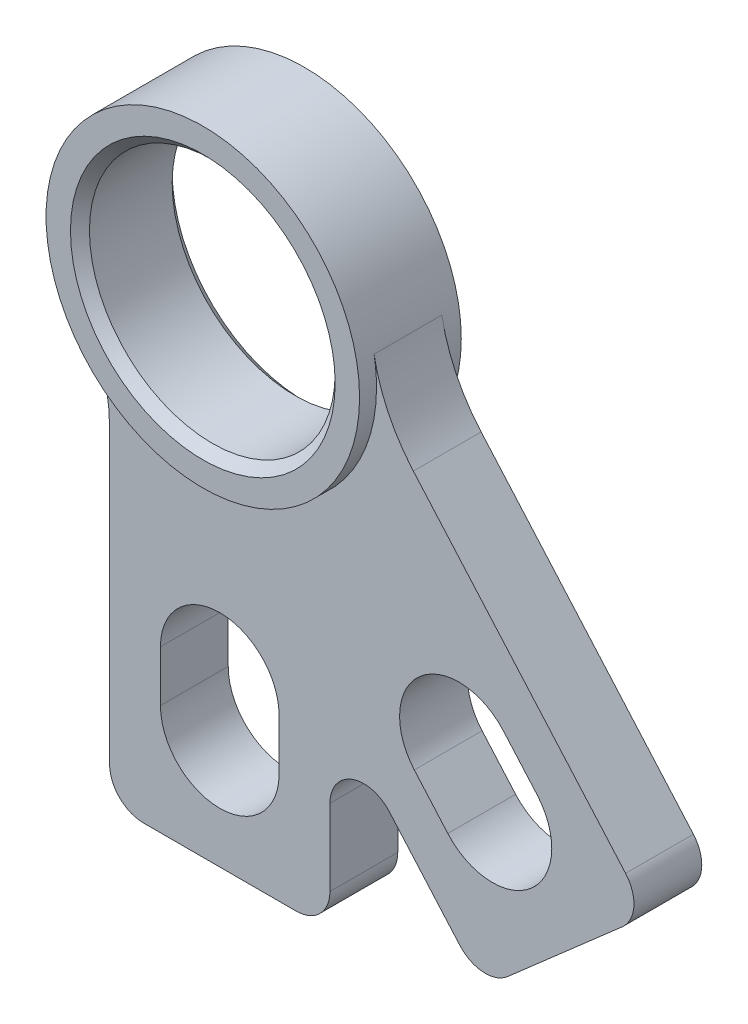
ISO-10303-21;
HEADER;
FILE_DESCRIPTION(('STEP AP214'),'2;1');
FILE_NAME('part.step','',(''),(''),'','','');
FILE_SCHEMA(('AUTOMOTIVE_DESIGN { 1 0 10303 214 1 1 1 1 }'));
ENDSEC;
DATA;
#1=APPLICATION_CONTEXT('core data for automotive mechanical design processes');
#2=APPLICATION_PROTOCOL_DEFINITION('international standard','automotive_design',2000,#1);
#3=PRODUCT_CONTEXT('',#1,'mechanical');
#4=PRODUCT('Part','Part','',(#3));
#5=PRODUCT_RELATED_PRODUCT_CATEGORY('part','',(#4));
#6=PRODUCT_DEFINITION_FORMATION('','',#4);
#7=PRODUCT_DEFINITION_CONTEXT('part definition',#1,'design');
#8=PRODUCT_DEFINITION('design','',#6,#7);
#9=PRODUCT_DEFINITION_SHAPE('','',#8);
#10=(LENGTH_UNIT() NAMED_UNIT(*) SI_UNIT(.MILLI.,.METRE.));
#11=(NAMED_UNIT(*) PLANE_ANGLE_UNIT() SI_UNIT($,.RADIAN.));
#12=(NAMED_UNIT(*) SI_UNIT($,.STERADIAN.) SOLID_ANGLE_UNIT());
#13=UNCERTAINTY_MEASURE_WITH_UNIT(LENGTH_MEASURE(1.E-05),#10,'distance_accuracy_value','');
#14=(GEOMETRIC_REPRESENTATION_CONTEXT(3) GLOBAL_UNCERTAINTY_ASSIGNED_CONTEXT((#13)) GLOBAL_UNIT_ASSIGNED_CONTEXT((#10,
#11,#12)) REPRESENTATION_CONTEXT('',''));
#15=CARTESIAN_POINT('',(0.,0.,0.));
#16=DIRECTION('',(0.,0.,1.));
#17=DIRECTION('',(1.,0.,0.));
#18=AXIS2_PLACEMENT_3D('',#15,#16,#17);
#19=CARTESIAN_POINT('',(0.,0.,4.7625));
#20=DIRECTION('',(0.,0.,-1.));
#21=DIRECTION('',(-1.,0.,0.));
#22=AXIS2_PLACEMENT_3D('',#19,#20,#21);
#23=CYLINDRICAL_SURFACE('',#22,11.5062);
#24=CARTESIAN_POINT('',(0.,0.,-3.87350000000002));
#25=DIRECTION('',(0.,0.,1.));
#26=DIRECTION('',(1.,0.,0.));
#27=AXIS2_PLACEMENT_3D('',#24,#25,#26);
#28=CIRCLE('',#27,11.5062);
#29=CARTESIAN_POINT('',(-11.5062,0.,-3.87350000000002));
#30=VERTEX_POINT('',#29);
#31=EDGE_CURVE('E42',#30,#30,#28,.F.);
#32=CARTESIAN_POINT('',(0.,0.,3.87349999999996));
#33=DIRECTION('',(0.,0.,1.));
#34=DIRECTION('',(1.,0.,0.));
#35=AXIS2_PLACEMENT_3D('',#32,#33,#34);
#36=CIRCLE('',#35,11.5062);
#37=CARTESIAN_POINT('',(-11.5062,0.,3.87349999999996));
#38=VERTEX_POINT('',#37);
#39=EDGE_CURVE('E370',#38,#38,#36,.T.);
#40=CARTESIAN_POINT('',(-11.5062,0.,-3.87350000000002));
#41=CARTESIAN_POINT('',(-11.5062,0.,-3.79280208333335));
#42=CARTESIAN_POINT('',(-11.5062,0.,-3.71210416666669));
#43=CARTESIAN_POINT('',(-11.5062,0.,-3.55070833333335));
#44=CARTESIAN_POINT('',(-11.5062,0.,-3.47001041666669));
#45=CARTESIAN_POINT('',(-11.5062,0.,-3.30861458333335));
#46=CARTESIAN_POINT('',(-11.5062,0.,-3.22791666666669));
#47=CARTESIAN_POINT('',(-11.5062,0.,-3.06652083333336));
#48=CARTESIAN_POINT('',(-11.5062,0.,-2.98582291666669));
#49=CARTESIAN_POINT('',(-11.5062,0.,-2.82442708333336));
#50=CARTESIAN_POINT('',(-11.5062,0.,-2.74372916666669));
#51=CARTESIAN_POINT('',(-11.5062,0.,-2.58233333333336));
#52=CARTESIAN_POINT('',(-11.5062,0.,-2.50163541666669));
#53=CARTESIAN_POINT('',(-11.5062,0.,-2.34023958333336));
#54=CARTESIAN_POINT('',(-11.5062,0.,-2.25954166666669));
#55=CARTESIAN_POINT('',(-11.5062,0.,-2.09814583333336));
#56=CARTESIAN_POINT('',(-11.5062,0.,-2.01744791666669));
#57=CARTESIAN_POINT('',(-11.5062,0.,-1.85605208333336));
#58=CARTESIAN_POINT('',(-11.5062,0.,-1.77535416666669));
#59=CARTESIAN_POINT('',(-11.5062,0.,-1.61395833333336));
#60=CARTESIAN_POINT('',(-11.5062,0.,-1.53326041666669));
#61=CARTESIAN_POINT('',(-11.5062,0.,-1.37186458333336));
#62=CARTESIAN_POINT('',(-11.5062,0.,-1.29116666666669));
#63=CARTESIAN_POINT('',(-11.5062,0.,-1.12977083333336));
#64=CARTESIAN_POINT('',(-11.5062,0.,-1.0490729166667));
#65=CARTESIAN_POINT('',(-11.5062,0.,-0.887677083333363));
#66=CARTESIAN_POINT('',(-11.5062,0.,-0.806979166666696));
#67=CARTESIAN_POINT('',(-11.5062,0.,-0.645583333333363));
#68=CARTESIAN_POINT('',(-11.5062,0.,-0.564885416666697));
#69=CARTESIAN_POINT('',(-11.5062,0.,-0.403489583333364));
#70=CARTESIAN_POINT('',(-11.5062,0.,-0.322791666666698));
#71=CARTESIAN_POINT('',(-11.5062,0.,-0.161395833333365));
#72=CARTESIAN_POINT('',(-11.5062,0.,-0.0806979166666985));
#73=CARTESIAN_POINT('',(-11.5062,0.,0.0806979166666343));
#74=CARTESIAN_POINT('',(-11.5062,0.,0.161395833333301));
#75=CARTESIAN_POINT('',(-11.5062,0.,0.322791666666634));
#76=CARTESIAN_POINT('',(-11.5062,0.,0.4034895833333));
#77=CARTESIAN_POINT('',(-11.5062,0.,0.564885416666633));
#78=CARTESIAN_POINT('',(-11.5062,0.,0.645583333333299));
#79=CARTESIAN_POINT('',(-11.5062,0.,0.806979166666632));
#80=CARTESIAN_POINT('',(-11.5062,0.,0.887677083333298));
#81=CARTESIAN_POINT('',(-11.5062,0.,1.04907291666663));
#82=CARTESIAN_POINT('',(-11.5062,0.,1.1297708333333));
#83=CARTESIAN_POINT('',(-11.5062,0.,1.29116666666663));
#84=CARTESIAN_POINT('',(-11.5062,0.,1.3718645833333));
#85=CARTESIAN_POINT('',(-11.5062,0.,1.53326041666663));
#86=CARTESIAN_POINT('',(-11.5062,0.,1.6139583333333));
#87=CARTESIAN_POINT('',(-11.5062,0.,1.77535416666663));
#88=CARTESIAN_POINT('',(-11.5062,0.,1.8560520833333));
#89=CARTESIAN_POINT('',(-11.5062,0.,2.01744791666663));
#90=CARTESIAN_POINT('',(-11.5062,0.,2.0981458333333));
#91=CARTESIAN_POINT('',(-11.5062,0.,2.25954166666663));
#92=CARTESIAN_POINT('',(-11.5062,0.,2.34023958333329));
#93=CARTESIAN_POINT('',(-11.5062,0.,2.50163541666663));
#94=CARTESIAN_POINT('',(-11.5062,0.,2.58233333333329));
#95=CARTESIAN_POINT('',(-11.5062,0.,2.74372916666663));
#96=CARTESIAN_POINT('',(-11.5062,0.,2.82442708333329));
#97=CARTESIAN_POINT('',(-11.5062,0.,2.98582291666663));
#98=CARTESIAN_POINT('',(-11.5062,0.,3.06652083333329));
#99=CARTESIAN_POINT('',(-11.5062,0.,3.22791666666662));
#100=CARTESIAN_POINT('',(-11.5062,0.,3.30861458333329));
#101=CARTESIAN_POINT('',(-11.5062,0.,3.47001041666662));
#102=CARTESIAN_POINT('',(-11.5062,0.,3.55070833333329));
#103=CARTESIAN_POINT('',(-11.5062,0.,3.71210416666662));
#104=CARTESIAN_POINT('',(-11.5062,0.,3.79280208333329));
#105=CARTESIAN_POINT('',(-11.5062,0.,3.87349999999996));
#106=B_SPLINE_CURVE_WITH_KNOTS('',3,(#40,#41,#42,#43,#44,#45,#46,#47,#48,#49,#50,#51,#52,#53,
#54,#55,#56,#57,#58,#59,#60,#61,#62,#63,#64,#65,#66,#67,#68,#69,#70,#71,#72,#73,#74,#75,#76,#77,
#78,#79,#80,#81,#82,#83,#84,#85,#86,#87,#88,#89,#90,#91,#92,#93,#94,#95,#96,#97,#98,#99,#100,
#101,#102,#103,#104,#105),.UNSPECIFIED.,.F.,.F.,(4,2,2,2,2,2,2,2,2,2,2,2,2,2,2,2,2,2,2,2,2,2,2,
2,2,2,2,2,2,2,2,2,4),(0.,0.24209375,0.484187499999998,0.726281249999999,0.968374999999996,
1.21046875,1.45256249999999,1.69465624999999,1.93674999999999,2.17884374999999,2.42093749999999,
2.66303124999999,2.90512499999999,3.14721874999999,3.38931249999999,3.63140624999999,
3.87349999999999,4.11559374999999,4.35768749999999,4.59978124999999,4.84187499999998,
5.08396874999998,5.32606249999998,5.56815624999998,5.81024999999998,6.05234374999998,
6.29443749999998,6.53653124999998,6.77862499999998,7.02071874999998,7.26281249999998,
7.50490624999998,7.74699999999998),.UNSPECIFIED.);
#107=EDGE_CURVE('BSEAM34',#30,#38,#106,.T.);
#108=ORIENTED_EDGE('',*,*,#31,.T.);
#109=ORIENTED_EDGE('',*,*,#39,.T.);
#110=ORIENTED_EDGE('',*,*,#107,.T.);
#111=ORIENTED_EDGE('',*,*,#107,.F.);
#112=EDGE_LOOP('',(#108,#110,#109,#111));
#113=FACE_BOUND('',#112,.T.);
#114=ADVANCED_FACE('F34',(#113),#23,.F.);
#115=CARTESIAN_POINT('',(0.,0.,4.7625));
#116=DIRECTION('',(0.,0.,-1.));
#117=DIRECTION('',(-1.,0.,0.));
#118=AXIS2_PLACEMENT_3D('',#115,#116,#117);
#119=CYLINDRICAL_SURFACE('',#118,14.6812);
#120=DIRECTION('',(0.,0.,-1.));
#121=VECTOR('',#120,1.);
#122=CARTESIAN_POINT('',(-12.585193266832,-7.559797872727,3.175));
#123=LINE('',#122,#121);
#124=CARTESIAN_POINT('',(-12.5851932668321,-7.55979787272669,3.175));
#125=VERTEX_POINT('',#124);
#126=CARTESIAN_POINT('',(-12.585193266832,-7.559797872727,-3.175));
#127=VERTEX_POINT('',#126);
#128=EDGE_CURVE('E197',#125,#127,#123,.T.);
#129=ORIENTED_EDGE('',*,*,#128,.F.);
#130=CARTESIAN_POINT('',(0.,0.,3.175));
#131=DIRECTION('',(0.,0.,1.));
#132=DIRECTION('',(1.,0.,0.));
#133=AXIS2_PLACEMENT_3D('',#130,#131,#132);
#134=CIRCLE('',#133,14.6812);
#135=CARTESIAN_POINT('',(14.4480147598735,2.60624306972274,3.175));
#136=VERTEX_POINT('',#135);
#137=EDGE_CURVE('E213',#125,#136,#134,.T.);
#138=ORIENTED_EDGE('',*,*,#137,.T.);
#139=DIRECTION('',(0.,0.,-1.));
#140=VECTOR('',#139,1.);
#141=CARTESIAN_POINT('',(14.4480147598735,2.60624306972275,3.175));
#142=LINE('',#141,#140);
#143=CARTESIAN_POINT('',(14.4480147598735,2.60624306972275,-3.175));
#144=VERTEX_POINT('',#143);
#145=EDGE_CURVE('E253',#136,#144,#142,.T.);
#146=ORIENTED_EDGE('',*,*,#145,.T.);
#147=CARTESIAN_POINT('',(0.,0.,-3.175));
#148=DIRECTION('',(0.,0.,1.));
#149=DIRECTION('',(1.,0.,0.));
#150=AXIS2_PLACEMENT_3D('',#147,#148,#149);
#151=CIRCLE('',#150,14.6812);
#152=EDGE_CURVE('E254',#127,#144,#151,.T.);
#153=ORIENTED_EDGE('',*,*,#152,.F.);
#154=EDGE_LOOP('',(#129,#138,#146,#153));
#155=FACE_BOUND('',#154,.T.);
#156=CARTESIAN_POINT('',(0.,0.,4.7625));
#157=DIRECTION('',(0.,0.,1.));
#158=DIRECTION('',(1.,0.,0.));
#159=AXIS2_PLACEMENT_3D('',#156,#157,#158);
#160=CIRCLE('',#159,14.6812);
#161=CARTESIAN_POINT('',(14.6812,0.,4.7625));
#162=VERTEX_POINT('',#161);
#163=EDGE_CURVE('E320',#162,#162,#160,.T.);
#164=ORIENTED_EDGE('',*,*,#163,.F.);
#165=EDGE_LOOP('',(#164));
#166=FACE_BOUND('',#165,.T.);
#167=CARTESIAN_POINT('',(0.,0.,-4.7625));
#168=DIRECTION('',(0.,0.,1.));
#169=DIRECTION('',(1.,0.,0.));
#170=AXIS2_PLACEMENT_3D('',#167,#168,#169);
#171=CIRCLE('',#170,14.6812);
#172=CARTESIAN_POINT('',(14.6812,0.,-4.7625));
#173=VERTEX_POINT('',#172);
#174=EDGE_CURVE('E308',#173,#173,#171,.T.);
#175=ORIENTED_EDGE('',*,*,#174,.T.);
#176=EDGE_LOOP('',(#175));
#177=FACE_BOUND('',#176,.T.);
#178=ADVANCED_FACE('F391',(#155,#166,#177),#119,.T.);
#179=CARTESIAN_POINT('',(0.,0.,4.7625));
#180=DIRECTION('',(0.,0.,1.));
#181=DIRECTION('',(1.,0.,0.));
#182=AXIS2_PLACEMENT_3D('',#179,#180,#181);
#183=PLANE('',#182);
#184=CARTESIAN_POINT('',(0.,0.,4.7625));
#185=DIRECTION('',(0.,0.,1.));
#186=DIRECTION('',(1.,0.,0.));
#187=AXIS2_PLACEMENT_3D('',#184,#185,#186);
#188=CIRCLE('',#187,12.3952);
#189=CARTESIAN_POINT('',(12.3952,0.,4.7625));
#190=VERTEX_POINT('',#189);
#191=EDGE_CURVE('E11',#190,#190,#188,.F.);
#192=ORIENTED_EDGE('',*,*,#191,.T.);
#193=EDGE_LOOP('',(#192));
#194=FACE_BOUND('',#193,.T.);
#195=ORIENTED_EDGE('',*,*,#163,.T.);
#196=EDGE_LOOP('',(#195));
#197=FACE_BOUND('',#196,.T.);
#198=ADVANCED_FACE('F387',(#194,#197),#183,.T.);
#199=CARTESIAN_POINT('',(0.,0.,-4.7625));
#200=DIRECTION('',(0.,0.,1.));
#201=DIRECTION('',(1.,0.,0.));
#202=AXIS2_PLACEMENT_3D('',#199,#200,#201);
#203=PLANE('',#202);
#204=CARTESIAN_POINT('',(0.,0.,-4.7625));
#205=DIRECTION('',(0.,0.,1.));
#206=DIRECTION('',(1.,0.,0.));
#207=AXIS2_PLACEMENT_3D('',#204,#205,#206);
#208=CIRCLE('',#207,12.3952);
#209=CARTESIAN_POINT('',(-12.3952,0.,-4.7625));
#210=VERTEX_POINT('',#209);
#211=EDGE_CURVE('E367',#210,#210,#208,.T.);
#212=ORIENTED_EDGE('',*,*,#211,.T.);
#213=EDGE_LOOP('',(#212));
#214=FACE_BOUND('',#213,.T.);
#215=ORIENTED_EDGE('',*,*,#174,.F.);
#216=EDGE_LOOP('',(#215));
#217=FACE_BOUND('',#216,.T.);
#218=ADVANCED_FACE('F383',(#214,#217),#203,.F.);
#219=CARTESIAN_POINT('',(0.,-31.1330697939258,3.175));
#220=DIRECTION('',(0.,0.,-1.));
#221=DIRECTION('',(-1.,0.,0.));
#222=AXIS2_PLACEMENT_3D('',#219,#220,#221);
#223=CYLINDRICAL_SURFACE('',#222,5.5562499999984);
#224=CARTESIAN_POINT('',(0.,-31.1330697939258,-3.175));
#225=DIRECTION('',(0.,0.,1.));
#226=DIRECTION('',(1.,0.,0.));
#227=AXIS2_PLACEMENT_3D('',#224,#225,#226);
#228=CIRCLE('',#227,5.5562499999984);
#229=CARTESIAN_POINT('',(5.55624999999834,-31.1330697939258,-3.175));
#230=VERTEX_POINT('',#229);
#231=CARTESIAN_POINT('',(-5.55624999999845,-31.1330697939258,-3.175));
#232=VERTEX_POINT('',#231);
#233=EDGE_CURVE('E288',#230,#232,#228,.T.);
#234=ORIENTED_EDGE('',*,*,#233,.F.);
#235=DIRECTION('',(0.,0.,-1.));
#236=VECTOR('',#235,1.);
#237=CARTESIAN_POINT('',(5.55624999999834,-31.1330697939258,3.175));
#238=LINE('',#237,#236);
#239=CARTESIAN_POINT('',(5.55624999999834,-31.1330697939258,3.175));
#240=VERTEX_POINT('',#239);
#241=EDGE_CURVE('E306',#240,#230,#238,.T.);
#242=ORIENTED_EDGE('',*,*,#241,.F.);
#243=CARTESIAN_POINT('',(0.,-31.1330697939258,3.175));
#244=DIRECTION('',(0.,0.,1.));
#245=DIRECTION('',(1.,0.,0.));
#246=AXIS2_PLACEMENT_3D('',#243,#244,#245);
#247=CIRCLE('',#246,5.5562499999984);
#248=CARTESIAN_POINT('',(-5.55624999999845,-31.1330697939258,3.175));
#249=VERTEX_POINT('',#248);
#250=EDGE_CURVE('E242',#240,#249,#247,.T.);
#251=ORIENTED_EDGE('',*,*,#250,.T.);
#252=DIRECTION('',(0.,0.,-1.));
#253=VECTOR('',#252,1.);
#254=CARTESIAN_POINT('',(-5.55624999999845,-31.1330697939258,3.175));
#255=LINE('',#254,#253);
#256=EDGE_CURVE('E299',#249,#232,#255,.T.);
#257=ORIENTED_EDGE('',*,*,#256,.T.);
#258=EDGE_LOOP('',(#234,#242,#251,#257));
#259=FACE_BOUND('',#258,.T.);
#260=ADVANCED_FACE('F386',(#259),#223,.F.);
#261=CARTESIAN_POINT('',(5.55624999999834,0.,3.175));
#262=DIRECTION('',(-1.,0.,0.));
#263=DIRECTION('',(0.,0.,1.));
#264=AXIS2_PLACEMENT_3D('',#261,#262,#263);
#265=PLANE('',#264);
#266=DIRECTION('',(0.,1.,0.));
#267=VECTOR('',#266,1.);
#268=CARTESIAN_POINT('',(5.55624999999834,0.,-3.175));
#269=LINE('',#268,#267);
#270=CARTESIAN_POINT('',(5.55624999999834,-35.895569793929,-3.175));
#271=VERTEX_POINT('',#270);
#272=EDGE_CURVE('E291',#271,#230,#269,.T.);
#273=ORIENTED_EDGE('',*,*,#272,.F.);
#274=DIRECTION('',(0.,0.,-1.));
#275=VECTOR('',#274,1.);
#276=CARTESIAN_POINT('',(5.55624999999834,-35.895569793929,3.175));
#277=LINE('',#276,#275);
#278=CARTESIAN_POINT('',(5.55624999999834,-35.895569793929,3.175));
#279=VERTEX_POINT('',#278);
#280=EDGE_CURVE('E304',#279,#271,#277,.T.);
#281=ORIENTED_EDGE('',*,*,#280,.F.);
#282=DIRECTION('',(0.,1.,0.));
#283=VECTOR('',#282,1.);
#284=CARTESIAN_POINT('',(5.55624999999834,0.,3.175));
#285=LINE('',#284,#283);
#286=EDGE_CURVE('E245',#279,#240,#285,.T.);
#287=ORIENTED_EDGE('',*,*,#286,.T.);
#288=ORIENTED_EDGE('',*,*,#241,.T.);
#289=EDGE_LOOP('',(#273,#281,#287,#288));
#290=FACE_BOUND('',#289,.T.);
#291=ADVANCED_FACE('F529',(#290),#265,.T.);
#292=CARTESIAN_POINT('',(0.,-35.895569793929,3.175));
#293=DIRECTION('',(0.,0.,-1.));
#294=DIRECTION('',(-1.,0.,0.));
#295=AXIS2_PLACEMENT_3D('',#292,#293,#294);
#296=CYLINDRICAL_SURFACE('',#295,5.5562499999984);
#297=CARTESIAN_POINT('',(0.,-35.895569793929,-3.175));
#298=DIRECTION('',(0.,0.,1.));
#299=DIRECTION('',(1.,0.,0.));
#300=AXIS2_PLACEMENT_3D('',#297,#298,#299);
#301=CIRCLE('',#300,5.5562499999984);
#302=CARTESIAN_POINT('',(-5.55624999999845,-35.895569793929,-3.175));
#303=VERTEX_POINT('',#302);
#304=EDGE_CURVE('E294',#303,#271,#301,.T.);
#305=ORIENTED_EDGE('',*,*,#304,.F.);
#306=DIRECTION('',(0.,0.,-1.));
#307=VECTOR('',#306,1.);
#308=CARTESIAN_POINT('',(-5.55624999999845,-35.895569793929,3.175));
#309=LINE('',#308,#307);
#310=CARTESIAN_POINT('',(-5.55624999999845,-35.895569793929,3.175));
#311=VERTEX_POINT('',#310);
#312=EDGE_CURVE('E301',#311,#303,#309,.T.);
#313=ORIENTED_EDGE('',*,*,#312,.F.);
#314=CARTESIAN_POINT('',(0.,-35.895569793929,3.175));
#315=DIRECTION('',(0.,0.,1.));
#316=DIRECTION('',(1.,0.,0.));
#317=AXIS2_PLACEMENT_3D('',#314,#315,#316);
#318=CIRCLE('',#317,5.5562499999984);
#319=EDGE_CURVE('E248',#311,#279,#318,.T.);
#320=ORIENTED_EDGE('',*,*,#319,.T.);
#321=ORIENTED_EDGE('',*,*,#280,.T.);
#322=EDGE_LOOP('',(#305,#313,#320,#321));
#323=FACE_BOUND('',#322,.T.);
#324=ADVANCED_FACE('F496',(#323),#296,.F.);
#325=CARTESIAN_POINT('',(22.3973953008331,-25.5678610496451,3.175));
#326=DIRECTION('',(0.,0.,-1.));
#327=DIRECTION('',(-1.,0.,0.));
#328=AXIS2_PLACEMENT_3D('',#325,#326,#327);
#329=CYLINDRICAL_SURFACE('',#328,5.5562499999983);
#330=CARTESIAN_POINT('',(22.3973953008331,-25.5678610496451,-3.175));
#331=DIRECTION('',(0.,0.,1.));
#332=DIRECTION('',(1.,0.,0.));
#333=AXIS2_PLACEMENT_3D('',#330,#331,#332);
#334=CIRCLE('',#333,5.5562499999983);
#335=CARTESIAN_POINT('',(26.576831798024,-21.9066830113041,-3.175));
#336=VERTEX_POINT('',#335);
#337=CARTESIAN_POINT('',(18.2179588036422,-29.229039087986,-3.175));
#338=VERTEX_POINT('',#337);
#339=EDGE_CURVE('E276',#336,#338,#334,.T.);
#340=ORIENTED_EDGE('',*,*,#339,.F.);
#341=DIRECTION('',(0.,0.,-1.));
#342=VECTOR('',#341,1.);
#343=CARTESIAN_POINT('',(26.576831798024,-21.9066830113041,3.175));
#344=LINE('',#343,#342);
#345=CARTESIAN_POINT('',(26.576831798024,-21.9066830113041,3.175));
#346=VERTEX_POINT('',#345);
#347=EDGE_CURVE('E302',#346,#336,#344,.T.);
#348=ORIENTED_EDGE('',*,*,#347,.F.);
#349=CARTESIAN_POINT('',(22.3973953008331,-25.5678610496451,3.175));
#350=DIRECTION('',(0.,0.,1.));
#351=DIRECTION('',(1.,0.,0.));
#352=AXIS2_PLACEMENT_3D('',#349,#350,#351);
#353=CIRCLE('',#352,5.5562499999983);
#354=CARTESIAN_POINT('',(18.2179588036422,-29.229039087986,3.175));
#355=VERTEX_POINT('',#354);
#356=EDGE_CURVE('E231',#346,#355,#353,.T.);
#357=ORIENTED_EDGE('',*,*,#356,.T.);
#358=DIRECTION('',(0.,0.,-1.));
#359=VECTOR('',#358,1.);
#360=CARTESIAN_POINT('',(18.2179588036422,-29.229039087986,3.175));
#361=LINE('',#360,#359);
#362=EDGE_CURVE('E309',#355,#338,#361,.T.);
#363=ORIENTED_EDGE('',*,*,#362,.T.);
#364=EDGE_LOOP('',(#340,#348,#357,#363));
#365=FACE_BOUND('',#364,.T.);
#366=ADVANCED_FACE('F488',(#365),#329,.F.);
#367=CARTESIAN_POINT('',(4.17943649719088,3.66117803834094,3.175));
#368=DIRECTION('',(-0.752204543926597,-0.658929680691484,0.));
#369=DIRECTION('',(0.658929680691484,-0.752204543926597,0.));
#370=AXIS2_PLACEMENT_3D('',#367,#368,#369);
#371=PLANE('',#370);
#372=DIRECTION('',(-0.658929680691484,0.752204543926597,0.));
#373=VECTOR('',#372,1.);
#374=CARTESIAN_POINT('',(4.17943649719088,3.66117803834094,-3.175));
#375=LINE('',#374,#373);
#376=CARTESIAN_POINT('',(29.7149844023193,-25.489057151757,-3.175));
#377=VERTEX_POINT('',#376);
#378=EDGE_CURVE('E279',#377,#336,#375,.T.);
#379=ORIENTED_EDGE('',*,*,#378,.F.);
#380=DIRECTION('',(0.,0.,-1.));
#381=VECTOR('',#380,1.);
#382=CARTESIAN_POINT('',(29.7149844023193,-25.489057151757,3.175));
#383=LINE('',#382,#381);
#384=CARTESIAN_POINT('',(29.7149844023193,-25.489057151757,3.175));
#385=VERTEX_POINT('',#384);
#386=EDGE_CURVE('E313',#385,#377,#383,.T.);
#387=ORIENTED_EDGE('',*,*,#386,.F.);
#388=DIRECTION('',(-0.658929680691484,0.752204543926597,0.));
#389=VECTOR('',#388,1.);
#390=CARTESIAN_POINT('',(4.17943649719088,3.66117803834094,3.175));
#391=LINE('',#390,#389);
#392=EDGE_CURVE('E234',#385,#346,#391,.T.);
#393=ORIENTED_EDGE('',*,*,#392,.T.);
#394=ORIENTED_EDGE('',*,*,#347,.T.);
#395=EDGE_LOOP('',(#379,#387,#393,#394));
#396=FACE_BOUND('',#395,.T.);
#397=ADVANCED_FACE('F482',(#396),#371,.T.);
#398=CARTESIAN_POINT('',(25.5355479051285,-29.1502351900979,3.175));
#399=DIRECTION('',(0.,0.,-1.));
#400=DIRECTION('',(-1.,0.,0.));
#401=AXIS2_PLACEMENT_3D('',#398,#399,#400);
#402=CYLINDRICAL_SURFACE('',#401,5.5562499999983);
#403=CARTESIAN_POINT('',(25.5355479051285,-29.1502351900979,-3.175));
#404=DIRECTION('',(0.,0.,1.));
#405=DIRECTION('',(1.,0.,0.));
#406=AXIS2_PLACEMENT_3D('',#403,#404,#405);
#407=CIRCLE('',#406,5.5562499999983);
#408=CARTESIAN_POINT('',(21.3561114079375,-32.8114132284388,-3.175));
#409=VERTEX_POINT('',#408);
#410=EDGE_CURVE('E282',#409,#377,#407,.T.);
#411=ORIENTED_EDGE('',*,*,#410,.F.);
#412=DIRECTION('',(0.,0.,-1.));
#413=VECTOR('',#412,1.);
#414=CARTESIAN_POINT('',(21.3561114079375,-32.8114132284388,3.175));
#415=LINE('',#414,#413);
#416=CARTESIAN_POINT('',(21.3561114079375,-32.8114132284388,3.175));
#417=VERTEX_POINT('',#416);
#418=EDGE_CURVE('E311',#417,#409,#415,.T.);
#419=ORIENTED_EDGE('',*,*,#418,.F.);
#420=CARTESIAN_POINT('',(25.5355479051285,-29.1502351900979,3.175));
#421=DIRECTION('',(0.,0.,1.));
#422=DIRECTION('',(1.,0.,0.));
#423=AXIS2_PLACEMENT_3D('',#420,#421,#422);
#424=CIRCLE('',#423,5.5562499999983);
#425=EDGE_CURVE('E237',#417,#385,#424,.T.);
#426=ORIENTED_EDGE('',*,*,#425,.T.);
#427=ORIENTED_EDGE('',*,*,#386,.T.);
#428=EDGE_LOOP('',(#411,#419,#426,#427));
#429=FACE_BOUND('',#428,.T.);
#430=ADVANCED_FACE('F478',(#429),#402,.F.);
#431=CARTESIAN_POINT('',(-26.193749999998,-15.7343197939275,3.175));
#432=DIRECTION('',(0.,0.,-1.));
#433=DIRECTION('',(-1.,0.,0.));
#434=AXIS2_PLACEMENT_3D('',#431,#432,#433);
#435=CYLINDRICAL_SURFACE('',#434,15.8749999999996);
#436=CARTESIAN_POINT('',(-26.193749999998,-15.7343197939275,-3.175));
#437=DIRECTION('',(0.,0.,1.));
#438=DIRECTION('',(1.,0.,0.));
#439=AXIS2_PLACEMENT_3D('',#436,#437,#438);
#440=CIRCLE('',#439,15.8749999999996);
#441=CARTESIAN_POINT('',(-10.3187499999984,-15.7343197939275,-3.175));
#442=VERTEX_POINT('',#441);
#443=EDGE_CURVE('E193',#442,#127,#440,.T.);
#444=ORIENTED_EDGE('',*,*,#443,.F.);
#445=DIRECTION('',(0.,0.,-1.));
#446=VECTOR('',#445,1.);
#447=CARTESIAN_POINT('',(-10.3187499999984,-15.7343197939275,3.175));
#448=LINE('',#447,#446);
#449=CARTESIAN_POINT('',(-10.3187499999984,-15.7343197939275,3.175));
#450=VERTEX_POINT('',#449);
#451=EDGE_CURVE('E186',#450,#442,#448,.T.);
#452=ORIENTED_EDGE('',*,*,#451,.F.);
#453=CARTESIAN_POINT('',(-26.193749999998,-15.7343197939275,3.175));
#454=DIRECTION('',(0.,0.,1.));
#455=DIRECTION('',(1.,0.,0.));
#456=AXIS2_PLACEMENT_3D('',#453,#454,#455);
#457=CIRCLE('',#456,15.8749999999996);
#458=EDGE_CURVE('E191',#450,#125,#457,.T.);
#459=ORIENTED_EDGE('',*,*,#458,.T.);
#460=ORIENTED_EDGE('',*,*,#128,.T.);
#461=EDGE_LOOP('',(#444,#452,#459,#460));
#462=FACE_BOUND('',#461,.T.);
#463=ADVANCED_FACE('F188',(#462),#435,.F.);
#464=CARTESIAN_POINT('',(-10.3187499999984,0.,3.175));
#465=DIRECTION('',(1.,0.,0.));
#466=DIRECTION('',(0.,1.,0.));
#467=AXIS2_PLACEMENT_3D('',#464,#465,#466);
#468=PLANE('',#467);
#469=DIRECTION('',(0.,-1.,0.));
#470=VECTOR('',#469,1.);
#471=CARTESIAN_POINT('',(-10.3187499999984,0.,-3.175));
#472=LINE('',#471,#470);
#473=CARTESIAN_POINT('',(-10.3187499999984,-43.0393197939274,-3.175));
#474=VERTEX_POINT('',#473);
#475=EDGE_CURVE('E258',#442,#474,#472,.T.);
#476=ORIENTED_EDGE('',*,*,#475,.T.);
#477=DIRECTION('',(0.,0.,-1.));
#478=VECTOR('',#477,1.);
#479=CARTESIAN_POINT('',(-10.3187499999984,-43.0393197939274,3.175));
#480=LINE('',#479,#478);
#481=CARTESIAN_POINT('',(-10.3187499999984,-43.0393197939274,3.175));
#482=VERTEX_POINT('',#481);
#483=EDGE_CURVE('E204',#474,#482,#480,.F.);
#484=ORIENTED_EDGE('',*,*,#483,.T.);
#485=DIRECTION('',(0.,-1.,0.));
#486=VECTOR('',#485,1.);
#487=CARTESIAN_POINT('',(-10.3187499999984,0.,3.175));
#488=LINE('',#487,#486);
#489=EDGE_CURVE('E201',#450,#482,#488,.T.);
#490=ORIENTED_EDGE('',*,*,#489,.F.);
#491=ORIENTED_EDGE('',*,*,#451,.T.);
#492=EDGE_LOOP('',(#476,#484,#490,#491));
#493=FACE_BOUND('',#492,.T.);
#494=ADVANCED_FACE('F202',(#493),#468,.F.);
#495=CARTESIAN_POINT('',(0.,-46.2143197939274,3.175));
#496=DIRECTION('',(0.,1.,0.));
#497=DIRECTION('',(-1.,0.,0.));
#498=AXIS2_PLACEMENT_3D('',#495,#496,#497);
#499=PLANE('',#498);
#500=DIRECTION('',(1.,0.,0.));
#501=VECTOR('',#500,1.);
#502=CARTESIAN_POINT('',(0.,-46.2143197939274,-3.175));
#503=LINE('',#502,#501);
#504=CARTESIAN_POINT('',(-7.14374999999845,-46.2143197939274,-3.175));
#505=VERTEX_POINT('',#504);
#506=CARTESIAN_POINT('',(7.14374999999837,-46.2143197939274,-3.175));
#507=VERTEX_POINT('',#506);
#508=EDGE_CURVE('E260',#505,#507,#503,.T.);
#509=ORIENTED_EDGE('',*,*,#508,.T.);
#510=DIRECTION('',(0.,0.,-1.));
#511=VECTOR('',#510,1.);
#512=CARTESIAN_POINT('',(7.14374999999837,-46.2143197939274,3.175));
#513=LINE('',#512,#511);
#514=CARTESIAN_POINT('',(7.14374999999837,-46.2143197939274,3.175));
#515=VERTEX_POINT('',#514);
#516=EDGE_CURVE('E57',#507,#515,#513,.F.);
#517=ORIENTED_EDGE('',*,*,#516,.T.);
#518=DIRECTION('',(1.,0.,0.));
#519=VECTOR('',#518,1.);
#520=CARTESIAN_POINT('',(0.,-46.2143197939274,3.175));
#521=LINE('',#520,#519);
#522=CARTESIAN_POINT('',(-7.14374999999845,-46.2143197939274,3.175));
#523=VERTEX_POINT('',#522);
#524=EDGE_CURVE('E206',#523,#515,#521,.T.);
#525=ORIENTED_EDGE('',*,*,#524,.F.);
#526=DIRECTION('',(0.,0.,-1.));
#527=VECTOR('',#526,1.);
#528=CARTESIAN_POINT('',(-7.14374999999845,-46.2143197939274,3.175));
#529=LINE('',#528,#527);
#530=EDGE_CURVE('E355',#523,#505,#529,.T.);
#531=ORIENTED_EDGE('',*,*,#530,.T.);
#532=EDGE_LOOP('',(#509,#517,#525,#531));
#533=FACE_BOUND('',#532,.T.);
#534=ADVANCED_FACE('F442',(#533),#499,.F.);
#535=CARTESIAN_POINT('',(10.3187499999987,0.,3.175));
#536=DIRECTION('',(-1.,0.,0.));
#537=DIRECTION('',(0.,-1.,0.));
#538=AXIS2_PLACEMENT_3D('',#535,#536,#537);
#539=PLANE('',#538);
#540=DIRECTION('',(0.,1.,0.));
#541=VECTOR('',#540,1.);
#542=CARTESIAN_POINT('',(10.3187499999987,0.,-3.175));
#543=LINE('',#542,#541);
#544=CARTESIAN_POINT('',(10.3187499999984,-43.0393197939274,-3.175));
#545=VERTEX_POINT('',#544);
#546=CARTESIAN_POINT('',(10.3187499999984,-35.8821445708664,-3.175));
#547=VERTEX_POINT('',#546);
#548=EDGE_CURVE('E262',#545,#547,#543,.T.);
#549=ORIENTED_EDGE('',*,*,#548,.T.);
#550=DIRECTION('',(0.,0.,-1.));
#551=VECTOR('',#550,1.);
#552=CARTESIAN_POINT('',(10.3187499999984,-35.8821445708664,3.175));
#553=LINE('',#552,#551);
#554=CARTESIAN_POINT('',(10.3187499999984,-35.8821445708664,3.175));
#555=VERTEX_POINT('',#554);
#556=EDGE_CURVE('E333',#547,#555,#553,.F.);
#557=ORIENTED_EDGE('',*,*,#556,.T.);
#558=DIRECTION('',(0.,1.,0.));
#559=VECTOR('',#558,1.);
#560=CARTESIAN_POINT('',(10.3187499999987,0.,3.175));
#561=LINE('',#560,#559);
#562=CARTESIAN_POINT('',(10.3187499999984,-43.0393197939274,3.175));
#563=VERTEX_POINT('',#562);
#564=EDGE_CURVE('E219',#563,#555,#561,.T.);
#565=ORIENTED_EDGE('',*,*,#564,.F.);
#566=DIRECTION('',(0.,0.,-1.));
#567=VECTOR('',#566,1.);
#568=CARTESIAN_POINT('',(10.3187499999984,-43.0393197939274,3.175));
#569=LINE('',#568,#567);
#570=EDGE_CURVE('E330',#563,#545,#569,.T.);
#571=ORIENTED_EDGE('',*,*,#570,.T.);
#572=EDGE_LOOP('',(#549,#557,#565,#571));
#573=FACE_BOUND('',#572,.T.);
#574=ADVANCED_FACE('F447',(#573),#539,.F.);
#575=CARTESIAN_POINT('',(-7.76181063764134,-6.79933064263417,3.175));
#576=DIRECTION('',(-0.752204543926597,-0.658929680691484,0.));
#577=DIRECTION('',(0.658929680691484,-0.752204543926597,0.));
#578=AXIS2_PLACEMENT_3D('',#575,#576,#577);
#579=PLANE('',#578);
#580=DIRECTION('',(-0.658929680691484,0.752204543926597,0.));
#581=VECTOR('',#580,1.);
#582=CARTESIAN_POINT('',(-7.76181063764134,-6.79933064263417,3.175));
#583=LINE('',#582,#581);
#584=CARTESIAN_POINT('',(22.4809661739258,-41.3231270434065,3.175));
#585=VERTEX_POINT('',#584);
#586=CARTESIAN_POINT('',(15.8819994269654,-33.790042834671,3.175));
#587=VERTEX_POINT('',#586);
#588=EDGE_CURVE('E222',#585,#587,#583,.T.);
#589=ORIENTED_EDGE('',*,*,#588,.T.);
#590=DIRECTION('',(0.,0.,-1.));
#591=VECTOR('',#590,1.);
#592=CARTESIAN_POINT('',(15.8819994269654,-33.790042834671,3.175));
#593=LINE('',#592,#591);
#594=CARTESIAN_POINT('',(15.8819994269654,-33.790042834671,-3.175));
#595=VERTEX_POINT('',#594);
#596=EDGE_CURVE('E327',#587,#595,#593,.T.);
#597=ORIENTED_EDGE('',*,*,#596,.T.);
#598=DIRECTION('',(-0.658929680691484,0.752204543926597,0.));
#599=VECTOR('',#598,1.);
#600=CARTESIAN_POINT('',(-7.76181063764134,-6.79933064263417,-3.175));
#601=LINE('',#600,#599);
#602=CARTESIAN_POINT('',(22.4809661739258,-41.3231270434065,-3.175));
#603=VERTEX_POINT('',#602);
#604=EDGE_CURVE('E265',#603,#595,#601,.T.);
#605=ORIENTED_EDGE('',*,*,#604,.F.);
#606=DIRECTION('',(0.,0.,-1.));
#607=VECTOR('',#606,1.);
#608=CARTESIAN_POINT('',(22.4809661739258,-41.3231270434065,3.175));
#609=LINE('',#608,#607);
#610=EDGE_CURVE('E323',#603,#585,#609,.F.);
#611=ORIENTED_EDGE('',*,*,#610,.T.);
#612=EDGE_LOOP('',(#589,#597,#605,#611));
#613=FACE_BOUND('',#612,.T.);
#614=ADVANCED_FACE('F453',(#613),#579,.T.);
#615=CARTESIAN_POINT('',(32.3348785477626,-36.9120458277393,3.175));
#616=DIRECTION('',(-0.658929680691483,0.752204543926597,0.));
#617=DIRECTION('',(-0.752204543926597,-0.658929680691483,0.));
#618=AXIS2_PLACEMENT_3D('',#615,#616,#617);
#619=PLANE('',#618);
#620=DIRECTION('',(0.752204543926597,0.658929680691483,0.));
#621=VECTOR('',#620,1.);
#622=CARTESIAN_POINT('',(32.3348785477626,-36.9120458277393,3.175));
#623=LINE('',#622,#621);
#624=CARTESIAN_POINT('',(26.9613173370882,-41.619274734178,3.175));
#625=VERTEX_POINT('',#624);
#626=CARTESIAN_POINT('',(37.7084397584371,-32.2048169213005,3.175));
#627=VERTEX_POINT('',#626);
#628=EDGE_CURVE('E225',#625,#627,#623,.T.);
#629=ORIENTED_EDGE('',*,*,#628,.F.);
#630=DIRECTION('',(0.,0.,-1.));
#631=VECTOR('',#630,1.);
#632=CARTESIAN_POINT('',(26.9613173370882,-41.619274734178,-3.175));
#633=LINE('',#632,#631);
#634=CARTESIAN_POINT('',(26.9613173370882,-41.619274734178,-3.175));
#635=VERTEX_POINT('',#634);
#636=EDGE_CURVE('E337',#625,#635,#633,.T.);
#637=ORIENTED_EDGE('',*,*,#636,.T.);
#638=DIRECTION('',(0.752204543926597,0.658929680691483,0.));
#639=VECTOR('',#638,1.);
#640=CARTESIAN_POINT('',(32.3348785477626,-36.9120458277393,-3.175));
#641=LINE('',#640,#639);
#642=CARTESIAN_POINT('',(37.7084397584371,-32.2048169213005,-3.175));
#643=VERTEX_POINT('',#642);
#644=EDGE_CURVE('E268',#635,#643,#641,.T.);
#645=ORIENTED_EDGE('',*,*,#644,.T.);
#646=DIRECTION('',(0.,0.,-1.));
#647=VECTOR('',#646,1.);
#648=CARTESIAN_POINT('',(37.7084397584371,-32.2048169213005,3.175));
#649=LINE('',#648,#647);
#650=EDGE_CURVE('E335',#643,#627,#649,.F.);
#651=ORIENTED_EDGE('',*,*,#650,.T.);
#652=EDGE_LOOP('',(#629,#637,#645,#651));
#653=FACE_BOUND('',#652,.T.);
#654=ADVANCED_FACE('F459',(#653),#619,.F.);
#655=CARTESIAN_POINT('',(7.76181063764143,6.79933064263425,3.175));
#656=DIRECTION('',(-0.752204543926597,-0.658929680691484,0.));
#657=DIRECTION('',(0.658929680691484,-0.752204543926597,0.));
#658=AXIS2_PLACEMENT_3D('',#655,#656,#657);
#659=PLANE('',#658);
#660=DIRECTION('',(-0.658929680691484,0.752204543926597,0.));
#661=VECTOR('',#660,1.);
#662=CARTESIAN_POINT('',(7.76181063764143,6.79933064263425,3.175));
#663=LINE('',#662,#661);
#664=CARTESIAN_POINT('',(38.0045874492086,-27.7244657581381,3.175));
#665=VERTEX_POINT('',#664);
#666=CARTESIAN_POINT('',(18.1296209553517,-5.0360962019521,3.175));
#667=VERTEX_POINT('',#666);
#668=EDGE_CURVE('E227',#665,#667,#663,.T.);
#669=ORIENTED_EDGE('',*,*,#668,.F.);
#670=DIRECTION('',(0.,0.,-1.));
#671=VECTOR('',#670,1.);
#672=CARTESIAN_POINT('',(38.0045874492086,-27.7244657581381,3.175));
#673=LINE('',#672,#671);
#674=CARTESIAN_POINT('',(38.0045874492086,-27.7244657581381,-3.175));
#675=VERTEX_POINT('',#674);
#676=EDGE_CURVE('E360',#665,#675,#673,.T.);
#677=ORIENTED_EDGE('',*,*,#676,.T.);
#678=DIRECTION('',(-0.658929680691484,0.752204543926597,0.));
#679=VECTOR('',#678,1.);
#680=CARTESIAN_POINT('',(7.76181063764143,6.79933064263425,-3.175));
#681=LINE('',#680,#679);
#682=CARTESIAN_POINT('',(18.1296209553517,-5.0360962019521,-3.175));
#683=VERTEX_POINT('',#682);
#684=EDGE_CURVE('E271',#675,#683,#681,.T.);
#685=ORIENTED_EDGE('',*,*,#684,.T.);
#686=DIRECTION('',(0.,0.,-1.));
#687=VECTOR('',#686,1.);
#688=CARTESIAN_POINT('',(18.1296209553517,-5.0360962019521,3.175));
#689=LINE('',#688,#687);
#690=EDGE_CURVE('E198',#667,#683,#689,.T.);
#691=ORIENTED_EDGE('',*,*,#690,.F.);
#692=EDGE_LOOP('',(#669,#677,#685,#691));
#693=FACE_BOUND('',#692,.T.);
#694=ADVANCED_FACE('F429',(#693),#659,.F.);
#695=CARTESIAN_POINT('',(-4.17943649719088,-3.66117803834094,3.175));
#696=DIRECTION('',(-0.752204543926597,-0.658929680691484,0.));
#697=DIRECTION('',(0.658929680691484,-0.752204543926597,0.));
#698=AXIS2_PLACEMENT_3D('',#695,#696,#697);
#699=PLANE('',#698);
#700=DIRECTION('',(-0.658929680691484,0.752204543926597,0.));
#701=VECTOR('',#700,1.);
#702=CARTESIAN_POINT('',(-4.17943649719088,-3.66117803834094,-3.175));
#703=LINE('',#702,#701);
#704=EDGE_CURVE('E285',#409,#338,#703,.T.);
#705=ORIENTED_EDGE('',*,*,#704,.T.);
#706=ORIENTED_EDGE('',*,*,#362,.F.);
#707=DIRECTION('',(-0.658929680691484,0.752204543926597,0.));
#708=VECTOR('',#707,1.);
#709=CARTESIAN_POINT('',(-4.17943649719088,-3.66117803834094,3.175));
#710=LINE('',#709,#708);
#711=EDGE_CURVE('E240',#417,#355,#710,.T.);
#712=ORIENTED_EDGE('',*,*,#711,.F.);
#713=ORIENTED_EDGE('',*,*,#418,.T.);
#714=EDGE_LOOP('',(#705,#706,#712,#713));
#715=FACE_BOUND('',#714,.T.);
#716=ADVANCED_FACE('F466',(#715),#699,.F.);
#717=CARTESIAN_POINT('',(30.0708680901861,5.42441247902495,3.175));
#718=DIRECTION('',(0.,0.,-1.));
#719=DIRECTION('',(-1.,0.,0.));
#720=AXIS2_PLACEMENT_3D('',#717,#718,#719);
#721=CYLINDRICAL_SURFACE('',#720,15.8749999999996);
#722=CARTESIAN_POINT('',(30.0708680901861,5.42441247902495,-3.175));
#723=DIRECTION('',(0.,0.,1.));
#724=DIRECTION('',(1.,0.,0.));
#725=AXIS2_PLACEMENT_3D('',#722,#723,#724);
#726=CIRCLE('',#725,15.8749999999996);
#727=EDGE_CURVE('E273',#683,#144,#726,.F.);
#728=ORIENTED_EDGE('',*,*,#727,.T.);
#729=ORIENTED_EDGE('',*,*,#145,.F.);
#730=CARTESIAN_POINT('',(30.0708680901861,5.42441247902495,3.175));
#731=DIRECTION('',(0.,0.,1.));
#732=DIRECTION('',(1.,0.,0.));
#733=AXIS2_PLACEMENT_3D('',#730,#731,#732);
#734=CIRCLE('',#733,15.8749999999996);
#735=EDGE_CURVE('E229',#667,#136,#734,.F.);
#736=ORIENTED_EDGE('',*,*,#735,.F.);
#737=ORIENTED_EDGE('',*,*,#690,.T.);
#738=EDGE_LOOP('',(#728,#729,#736,#737));
#739=FACE_BOUND('',#738,.T.);
#740=ADVANCED_FACE('F437',(#739),#721,.F.);
#741=CARTESIAN_POINT('',(-5.55624999999845,0.,3.175));
#742=DIRECTION('',(-1.,0.,0.));
#743=DIRECTION('',(0.,0.,1.));
#744=AXIS2_PLACEMENT_3D('',#741,#742,#743);
#745=PLANE('',#744);
#746=DIRECTION('',(0.,1.,0.));
#747=VECTOR('',#746,1.);
#748=CARTESIAN_POINT('',(-5.55624999999845,0.,-3.175));
#749=LINE('',#748,#747);
#750=EDGE_CURVE('E215',#303,#232,#749,.T.);
#751=ORIENTED_EDGE('',*,*,#750,.T.);
#752=ORIENTED_EDGE('',*,*,#256,.F.);
#753=DIRECTION('',(0.,1.,0.));
#754=VECTOR('',#753,1.);
#755=CARTESIAN_POINT('',(-5.55624999999845,0.,3.175));
#756=LINE('',#755,#754);
#757=EDGE_CURVE('E251',#311,#249,#756,.T.);
#758=ORIENTED_EDGE('',*,*,#757,.F.);
#759=ORIENTED_EDGE('',*,*,#312,.T.);
#760=EDGE_LOOP('',(#751,#752,#758,#759));
#761=FACE_BOUND('',#760,.T.);
#762=ADVANCED_FACE('F499',(#761),#745,.F.);
#763=CARTESIAN_POINT('',(0.,0.,3.175));
#764=DIRECTION('',(0.,0.,1.));
#765=DIRECTION('',(1.,0.,0.));
#766=AXIS2_PLACEMENT_3D('',#763,#764,#765);
#767=PLANE('',#766);
#768=ORIENTED_EDGE('',*,*,#588,.F.);
#769=CARTESIAN_POINT('',(24.8692156008927,-39.231025307211,3.175));
#770=DIRECTION('',(0.,0.,1.));
#771=DIRECTION('',(1.,0.,0.));
#772=AXIS2_PLACEMENT_3D('',#769,#770,#771);
#773=CIRCLE('',#772,3.175);
#774=EDGE_CURVE('E353',#585,#625,#773,.T.);
#775=ORIENTED_EDGE('',*,*,#774,.T.);
#776=ORIENTED_EDGE('',*,*,#628,.T.);
#777=CARTESIAN_POINT('',(35.6163380222416,-29.8165674943336,3.175));
#778=DIRECTION('',(0.,0.,1.));
#779=DIRECTION('',(1.,0.,0.));
#780=AXIS2_PLACEMENT_3D('',#777,#778,#779);
#781=CIRCLE('',#780,3.175);
#782=EDGE_CURVE('E49',#627,#665,#781,.T.);
#783=ORIENTED_EDGE('',*,*,#782,.T.);
#784=ORIENTED_EDGE('',*,*,#668,.T.);
#785=ORIENTED_EDGE('',*,*,#735,.T.);
#786=ORIENTED_EDGE('',*,*,#137,.F.);
#787=ORIENTED_EDGE('',*,*,#458,.F.);
#788=ORIENTED_EDGE('',*,*,#489,.T.);
#789=CARTESIAN_POINT('',(-7.14374999999845,-43.0393197939274,3.175));
#790=DIRECTION('',(0.,0.,1.));
#791=DIRECTION('',(1.,0.,0.));
#792=AXIS2_PLACEMENT_3D('',#789,#790,#791);
#793=CIRCLE('',#792,3.175);
#794=EDGE_CURVE('E349',#482,#523,#793,.T.);
#795=ORIENTED_EDGE('',*,*,#794,.T.);
#796=ORIENTED_EDGE('',*,*,#524,.T.);
#797=CARTESIAN_POINT('',(7.14374999999837,-43.0393197939274,3.175));
#798=DIRECTION('',(0.,0.,1.));
#799=DIRECTION('',(1.,0.,0.));
#800=AXIS2_PLACEMENT_3D('',#797,#798,#799);
#801=CIRCLE('',#800,3.175);
#802=EDGE_CURVE('E351',#515,#563,#801,.T.);
#803=ORIENTED_EDGE('',*,*,#802,.T.);
#804=ORIENTED_EDGE('',*,*,#564,.T.);
#805=CARTESIAN_POINT('',(13.4937499999984,-35.8821445708665,3.175));
#806=DIRECTION('',(0.,0.,1.));
#807=DIRECTION('',(1.,0.,0.));
#808=AXIS2_PLACEMENT_3D('',#805,#806,#807);
#809=CIRCLE('',#808,3.175);
#810=EDGE_CURVE('E365',#555,#587,#809,.F.);
#811=ORIENTED_EDGE('',*,*,#810,.T.);
#812=EDGE_LOOP('',(#768,#775,#776,#783,#784,#785,#786,#787,#788,#795,#796,#803,#804,#811));
#813=FACE_BOUND('',#812,.T.);
#814=ORIENTED_EDGE('',*,*,#356,.F.);
#815=ORIENTED_EDGE('',*,*,#392,.F.);
#816=ORIENTED_EDGE('',*,*,#425,.F.);
#817=ORIENTED_EDGE('',*,*,#711,.T.);
#818=EDGE_LOOP('',(#814,#815,#816,#817));
#819=FACE_BOUND('',#818,.T.);
#820=ORIENTED_EDGE('',*,*,#250,.F.);
#821=ORIENTED_EDGE('',*,*,#286,.F.);
#822=ORIENTED_EDGE('',*,*,#319,.F.);
#823=ORIENTED_EDGE('',*,*,#757,.T.);
#824=EDGE_LOOP('',(#820,#821,#822,#823));
#825=FACE_BOUND('',#824,.T.);
#826=ADVANCED_FACE('F210',(#813,#819,#825),#767,.T.);
#827=CARTESIAN_POINT('',(0.,0.,-3.175));
#828=DIRECTION('',(0.,0.,1.));
#829=DIRECTION('',(1.,0.,0.));
#830=AXIS2_PLACEMENT_3D('',#827,#828,#829);
#831=PLANE('',#830);
#832=ORIENTED_EDGE('',*,*,#644,.F.);
#833=CARTESIAN_POINT('',(24.8692156008927,-39.231025307211,-3.175));
#834=DIRECTION('',(0.,0.,1.));
#835=DIRECTION('',(1.,0.,0.));
#836=AXIS2_PLACEMENT_3D('',#833,#834,#835);
#837=CIRCLE('',#836,3.175);
#838=EDGE_CURVE('E346',#635,#603,#837,.F.);
#839=ORIENTED_EDGE('',*,*,#838,.T.);
#840=ORIENTED_EDGE('',*,*,#604,.T.);
#841=CARTESIAN_POINT('',(13.4937499999984,-35.8821445708665,-3.175));
#842=DIRECTION('',(0.,0.,1.));
#843=DIRECTION('',(1.,0.,0.));
#844=AXIS2_PLACEMENT_3D('',#841,#842,#843);
#845=CIRCLE('',#844,3.175);
#846=EDGE_CURVE('E363',#595,#547,#845,.T.);
#847=ORIENTED_EDGE('',*,*,#846,.T.);
#848=ORIENTED_EDGE('',*,*,#548,.F.);
#849=CARTESIAN_POINT('',(7.14374999999837,-43.0393197939274,-3.175));
#850=DIRECTION('',(0.,0.,1.));
#851=DIRECTION('',(1.,0.,0.));
#852=AXIS2_PLACEMENT_3D('',#849,#850,#851);
#853=CIRCLE('',#852,3.175);
#854=EDGE_CURVE('E344',#545,#507,#853,.F.);
#855=ORIENTED_EDGE('',*,*,#854,.T.);
#856=ORIENTED_EDGE('',*,*,#508,.F.);
#857=CARTESIAN_POINT('',(-7.14374999999845,-43.0393197939274,-3.175));
#858=DIRECTION('',(0.,0.,1.));
#859=DIRECTION('',(1.,0.,0.));
#860=AXIS2_PLACEMENT_3D('',#857,#858,#859);
#861=CIRCLE('',#860,3.175);
#862=EDGE_CURVE('E342',#505,#474,#861,.F.);
#863=ORIENTED_EDGE('',*,*,#862,.T.);
#864=ORIENTED_EDGE('',*,*,#475,.F.);
#865=ORIENTED_EDGE('',*,*,#443,.T.);
#866=ORIENTED_EDGE('',*,*,#152,.T.);
#867=ORIENTED_EDGE('',*,*,#727,.F.);
#868=ORIENTED_EDGE('',*,*,#684,.F.);
#869=CARTESIAN_POINT('',(35.6163380222416,-29.8165674943336,-3.175));
#870=DIRECTION('',(0.,0.,1.));
#871=DIRECTION('',(1.,0.,0.));
#872=AXIS2_PLACEMENT_3D('',#869,#870,#871);
#873=CIRCLE('',#872,3.175);
#874=EDGE_CURVE('E340',#675,#643,#873,.F.);
#875=ORIENTED_EDGE('',*,*,#874,.T.);
#876=EDGE_LOOP('',(#832,#839,#840,#847,#848,#855,#856,#863,#864,#865,#866,#867,#868,#875));
#877=FACE_BOUND('',#876,.T.);
#878=ORIENTED_EDGE('',*,*,#339,.T.);
#879=ORIENTED_EDGE('',*,*,#704,.F.);
#880=ORIENTED_EDGE('',*,*,#410,.T.);
#881=ORIENTED_EDGE('',*,*,#378,.T.);
#882=EDGE_LOOP('',(#878,#879,#880,#881));
#883=FACE_BOUND('',#882,.T.);
#884=ORIENTED_EDGE('',*,*,#233,.T.);
#885=ORIENTED_EDGE('',*,*,#750,.F.);
#886=ORIENTED_EDGE('',*,*,#304,.T.);
#887=ORIENTED_EDGE('',*,*,#272,.T.);
#888=EDGE_LOOP('',(#884,#885,#886,#887));
#889=FACE_BOUND('',#888,.T.);
#890=ADVANCED_FACE('F408',(#877,#883,#889),#831,.F.);
#891=CARTESIAN_POINT('',(13.4937499999984,-35.8821445708665,3.175));
#892=DIRECTION('',(0.,0.,-1.));
#893=DIRECTION('',(-1.,0.,0.));
#894=AXIS2_PLACEMENT_3D('',#891,#892,#893);
#895=CYLINDRICAL_SURFACE('',#894,3.175);
#896=ORIENTED_EDGE('',*,*,#810,.F.);
#897=ORIENTED_EDGE('',*,*,#556,.F.);
#898=ORIENTED_EDGE('',*,*,#846,.F.);
#899=ORIENTED_EDGE('',*,*,#596,.F.);
#900=EDGE_LOOP('',(#896,#897,#898,#899));
#901=FACE_BOUND('',#900,.T.);
#902=ADVANCED_FACE('F404',(#901),#895,.F.);
#903=CARTESIAN_POINT('',(24.8692156008927,-39.231025307211,3.175));
#904=DIRECTION('',(0.,0.,1.));
#905=DIRECTION('',(1.,0.,0.));
#906=AXIS2_PLACEMENT_3D('',#903,#904,#905);
#907=CYLINDRICAL_SURFACE('',#906,3.175);
#908=ORIENTED_EDGE('',*,*,#774,.F.);
#909=ORIENTED_EDGE('',*,*,#610,.F.);
#910=ORIENTED_EDGE('',*,*,#838,.F.);
#911=ORIENTED_EDGE('',*,*,#636,.F.);
#912=EDGE_LOOP('',(#908,#909,#910,#911));
#913=FACE_BOUND('',#912,.T.);
#914=ADVANCED_FACE('F407',(#913),#907,.T.);
#915=CARTESIAN_POINT('',(7.14374999999837,-43.0393197939274,3.175));
#916=DIRECTION('',(0.,0.,-1.));
#917=DIRECTION('',(-1.,0.,0.));
#918=AXIS2_PLACEMENT_3D('',#915,#916,#917);
#919=CYLINDRICAL_SURFACE('',#918,3.175);
#920=ORIENTED_EDGE('',*,*,#802,.F.);
#921=ORIENTED_EDGE('',*,*,#516,.F.);
#922=ORIENTED_EDGE('',*,*,#854,.F.);
#923=ORIENTED_EDGE('',*,*,#570,.F.);
#924=EDGE_LOOP('',(#920,#921,#922,#923));
#925=FACE_BOUND('',#924,.T.);
#926=ADVANCED_FACE('F412',(#925),#919,.T.);
#927=CARTESIAN_POINT('',(-7.14374999999845,-43.0393197939274,3.175));
#928=DIRECTION('',(0.,0.,-1.));
#929=DIRECTION('',(-1.,0.,0.));
#930=AXIS2_PLACEMENT_3D('',#927,#928,#929);
#931=CYLINDRICAL_SURFACE('',#930,3.175);
#932=ORIENTED_EDGE('',*,*,#794,.F.);
#933=ORIENTED_EDGE('',*,*,#483,.F.);
#934=ORIENTED_EDGE('',*,*,#862,.F.);
#935=ORIENTED_EDGE('',*,*,#530,.F.);
#936=EDGE_LOOP('',(#932,#933,#934,#935));
#937=FACE_BOUND('',#936,.T.);
#938=ADVANCED_FACE('F416',(#937),#931,.T.);
#939=CARTESIAN_POINT('',(35.6163380222416,-29.8165674943336,3.175));
#940=DIRECTION('',(0.,0.,-1.));
#941=DIRECTION('',(-1.,0.,0.));
#942=AXIS2_PLACEMENT_3D('',#939,#940,#941);
#943=CYLINDRICAL_SURFACE('',#942,3.175);
#944=ORIENTED_EDGE('',*,*,#782,.F.);
#945=ORIENTED_EDGE('',*,*,#650,.F.);
#946=ORIENTED_EDGE('',*,*,#874,.F.);
#947=ORIENTED_EDGE('',*,*,#676,.F.);
#948=EDGE_LOOP('',(#944,#945,#946,#947));
#949=FACE_BOUND('',#948,.T.);
#950=ADVANCED_FACE('F380',(#949),#943,.T.);
#951=CARTESIAN_POINT('',(0.,0.,-4.7625));
#952=DIRECTION('',(0.,0.,-1.));
#953=DIRECTION('',(-1.,0.,0.));
#954=AXIS2_PLACEMENT_3D('',#951,#952,#953);
#955=CONICAL_SURFACE('',#954,12.3952,0.785398163397449);
#956=CARTESIAN_POINT('',(-11.5062,0.,-3.87350000000002));
#957=CARTESIAN_POINT('',(-11.5154604166667,0.,-3.88276041666669));
#958=CARTESIAN_POINT('',(-11.5247208333333,0.,-3.89202083333335));
#959=CARTESIAN_POINT('',(-11.5432416666667,0.,-3.91054166666669));
#960=CARTESIAN_POINT('',(-11.5525020833333,0.,-3.91980208333335));
#961=CARTESIAN_POINT('',(-11.5710229166667,0.,-3.93832291666669));
#962=CARTESIAN_POINT('',(-11.5802833333333,0.,-3.94758333333335));
#963=CARTESIAN_POINT('',(-11.5988041666667,0.,-3.96610416666668));
#964=CARTESIAN_POINT('',(-11.6080645833333,0.,-3.97536458333335));
#965=CARTESIAN_POINT('',(-11.6265854166667,0.,-3.99388541666668));
#966=CARTESIAN_POINT('',(-11.6358458333333,0.,-4.00314583333335));
#967=CARTESIAN_POINT('',(-11.6543666666667,0.,-4.02166666666668));
#968=CARTESIAN_POINT('',(-11.6636270833333,0.,-4.03092708333335));
#969=CARTESIAN_POINT('',(-11.6821479166667,0.,-4.04944791666668));
#970=CARTESIAN_POINT('',(-11.6914083333333,0.,-4.05870833333335));
#971=CARTESIAN_POINT('',(-11.7099291666667,0.,-4.07722916666668));
#972=CARTESIAN_POINT('',(-11.7191895833333,0.,-4.08648958333335));
#973=CARTESIAN_POINT('',(-11.7377104166667,0.,-4.10501041666668));
#974=CARTESIAN_POINT('',(-11.7469708333333,0.,-4.11427083333335));
#975=CARTESIAN_POINT('',(-11.7654916666667,0.,-4.13279166666668));
#976=CARTESIAN_POINT('',(-11.7747520833333,0.,-4.14205208333335));
#977=CARTESIAN_POINT('',(-11.7932729166667,0.,-4.16057291666668));
#978=CARTESIAN_POINT('',(-11.8025333333333,0.,-4.16983333333335));
#979=CARTESIAN_POINT('',(-11.8210541666667,0.,-4.18835416666668));
#980=CARTESIAN_POINT('',(-11.8303145833333,0.,-4.19761458333335));
#981=CARTESIAN_POINT('',(-11.8488354166667,0.,-4.21613541666668));
#982=CARTESIAN_POINT('',(-11.8580958333333,0.,-4.22539583333335));
#983=CARTESIAN_POINT('',(-11.8766166666667,0.,-4.24391666666668));
#984=CARTESIAN_POINT('',(-11.8858770833333,0.,-4.25317708333335));
#985=CARTESIAN_POINT('',(-11.9043979166667,0.,-4.27169791666668));
#986=CARTESIAN_POINT('',(-11.9136583333333,0.,-4.28095833333334));
#987=CARTESIAN_POINT('',(-11.9321791666667,0.,-4.29947916666668));
#988=CARTESIAN_POINT('',(-11.9414395833333,0.,-4.30873958333334));
#989=CARTESIAN_POINT('',(-11.9599604166667,0.,-4.32726041666668));
#990=CARTESIAN_POINT('',(-11.9692208333333,0.,-4.33652083333334));
#991=CARTESIAN_POINT('',(-11.9877416666667,0.,-4.35504166666668));
#992=CARTESIAN_POINT('',(-11.9970020833333,0.,-4.36430208333334));
#993=CARTESIAN_POINT('',(-12.0155229166667,0.,-4.38282291666668));
#994=CARTESIAN_POINT('',(-12.0247833333333,0.,-4.39208333333334));
#995=CARTESIAN_POINT('',(-12.0433041666667,0.,-4.41060416666667));
#996=CARTESIAN_POINT('',(-12.0525645833333,0.,-4.41986458333334));
#997=CARTESIAN_POINT('',(-12.0710854166667,0.,-4.43838541666667));
#998=CARTESIAN_POINT('',(-12.0803458333333,0.,-4.44764583333334));
#999=CARTESIAN_POINT('',(-12.0988666666667,0.,-4.46616666666668));
#1000=CARTESIAN_POINT('',(-12.1081270833333,0.,-4.47542708333334));
#1001=CARTESIAN_POINT('',(-12.1266479166667,0.,-4.49394791666667));
#1002=CARTESIAN_POINT('',(-12.1359083333333,0.,-4.50320833333334));
#1003=CARTESIAN_POINT('',(-12.1544291666667,0.,-4.52172916666667));
#1004=CARTESIAN_POINT('',(-12.1636895833333,0.,-4.53098958333334));
#1005=CARTESIAN_POINT('',(-12.1822104166667,0.,-4.54951041666667));
#1006=CARTESIAN_POINT('',(-12.1914708333333,0.,-4.55877083333334));
#1007=CARTESIAN_POINT('',(-12.2099916666667,0.,-4.57729166666667));
#1008=CARTESIAN_POINT('',(-12.2192520833333,0.,-4.58655208333334));
#1009=CARTESIAN_POINT('',(-12.2377729166666,0.,-4.60507291666667));
#1010=CARTESIAN_POINT('',(-12.2470333333333,0.,-4.61433333333334));
#1011=CARTESIAN_POINT('',(-12.2655541666666,0.,-4.63285416666667));
#1012=CARTESIAN_POINT('',(-12.2748145833333,0.,-4.64211458333334));
#1013=CARTESIAN_POINT('',(-12.2933354166667,0.,-4.66063541666667));
#1014=CARTESIAN_POINT('',(-12.3025958333333,0.,-4.66989583333334));
#1015=CARTESIAN_POINT('',(-12.3211166666666,0.,-4.68841666666667));
#1016=CARTESIAN_POINT('',(-12.3303770833333,0.,-4.69767708333334));
#1017=CARTESIAN_POINT('',(-12.3488979166666,0.,-4.71619791666667));
#1018=CARTESIAN_POINT('',(-12.3581583333333,0.,-4.72545833333333));
#1019=CARTESIAN_POINT('',(-12.3766791666666,0.,-4.74397916666667));
#1020=CARTESIAN_POINT('',(-12.3859395833333,0.,-4.75323958333333));
#1021=CARTESIAN_POINT('',(-12.3952,0.,-4.7625));
#1022=B_SPLINE_CURVE_WITH_KNOTS('',3,(#956,#957,#958,#959,#960,#961,#962,#963,#964,#965,#966,
#967,#968,#969,#970,#971,#972,#973,#974,#975,#976,#977,#978,#979,#980,#981,#982,#983,#984,#985,
#986,#987,#988,#989,#990,#991,#992,#993,#994,#995,#996,#997,#998,#999,#1000,#1001,#1002,#1003,
#1004,#1005,#1006,#1007,#1008,#1009,#1010,#1011,#1012,#1013,#1014,#1015,#1016,#1017,#1018,#1019,
#1020,#1021),.UNSPECIFIED.,.F.,.F.,(4,2,2,2,2,2,2,2,2,2,2,2,2,2,2,2,2,2,2,2,2,2,2,2,2,2,2,2,2,2,
2,2,4),(0.,0.0392886205296764,0.078577241059353,0.117865861589031,0.157154482118707,
0.196443102648384,0.23573172317806,0.275020343707737,0.314308964237413,0.353597584767091,
0.392886205296768,0.432174825826444,0.47146344635612,0.510752066885797,0.550040687415474,
0.589329307945151,0.628617928474828,0.667906549004505,0.707195169534181,0.746483790063857,
0.785772410593534,0.82506103112321,0.864349651652888,0.903638272182564,0.942926892712241,
0.982215513241918,1.02150413377159,1.06079275430127,1.10008137483095,1.13936999536063,
1.1786586158903,1.21794723641998,1.25723585694965),.UNSPECIFIED.);
#1023=EDGE_CURVE('BSEAM377',#30,#210,#1022,.T.);
#1024=ORIENTED_EDGE('',*,*,#31,.F.);
#1025=ORIENTED_EDGE('',*,*,#211,.F.);
#1026=ORIENTED_EDGE('',*,*,#1023,.T.);
#1027=ORIENTED_EDGE('',*,*,#1023,.F.);
#1028=EDGE_LOOP('',(#1024,#1026,#1025,#1027));
#1029=FACE_BOUND('',#1028,.T.);
#1030=ADVANCED_FACE('F377',(#1029),#955,.F.);
#1031=CARTESIAN_POINT('',(0.,0.,3.87349999999996));
#1032=DIRECTION('',(0.,0.,1.));
#1033=DIRECTION('',(1.,0.,0.));
#1034=AXIS2_PLACEMENT_3D('',#1031,#1032,#1033);
#1035=CONICAL_SURFACE('',#1034,11.5062,0.785398163397447);
#1036=ORIENTED_EDGE('',*,*,#191,.F.);
#1037=EDGE_LOOP('',(#1036));
#1038=FACE_BOUND('',#1037,.T.);
#1039=ORIENTED_EDGE('',*,*,#39,.F.);
#1040=EDGE_LOOP('',(#1039));
#1041=FACE_BOUND('',#1040,.T.);
#1042=ADVANCED_FACE('F36',(#1038,#1041),#1035,.F.);
#1043=CLOSED_SHELL('',(#114,#178,#198,#218,#260,#291,#324,#366,#397,#430,#463,#494,#534,#574,
#614,#654,#694,#716,#740,#762,#826,#890,#902,#914,#926,#938,#950,#1030,#1042));
#1044=MANIFOLD_SOLID_BREP('B2',#1043);
#1045=ADVANCED_BREP_SHAPE_REPRESENTATION('',(#18,#1044),#14);
#1046=SHAPE_DEFINITION_REPRESENTATION(#9,#1045);
ENDSEC;
END-ISO-10303-21;
